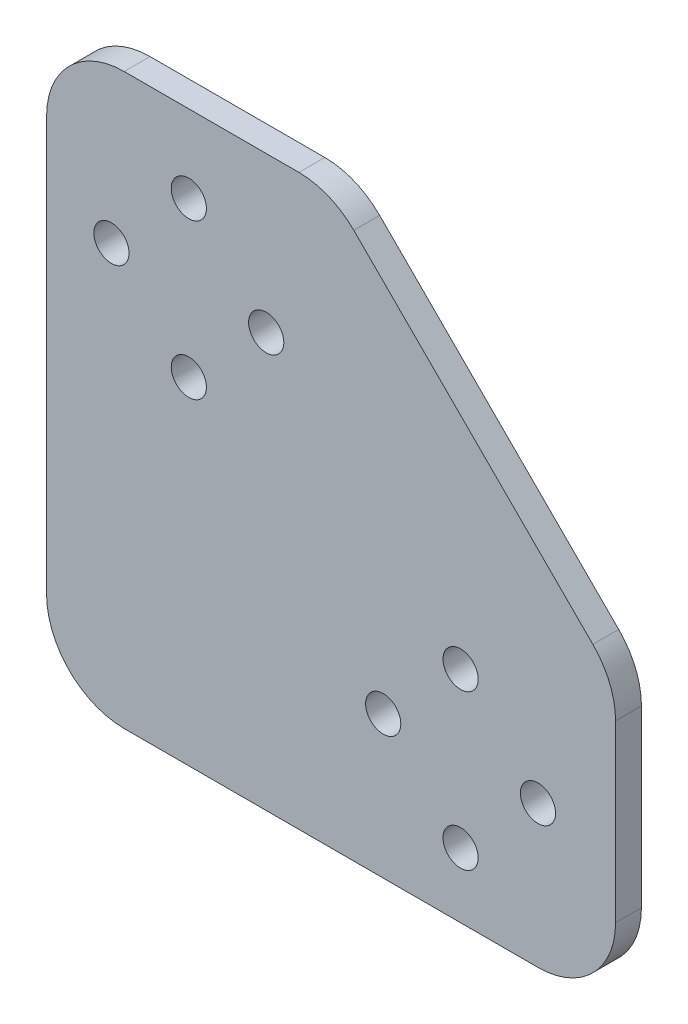
ISO-10303-21;
HEADER;
FILE_DESCRIPTION(('STEP AP214'),'2;1');
FILE_NAME('part.step','',(''),(''),'','','');
FILE_SCHEMA(('AUTOMOTIVE_DESIGN { 1 0 10303 214 1 1 1 1 }'));
ENDSEC;
DATA;
#1=APPLICATION_CONTEXT('core data for automotive mechanical design processes');
#2=APPLICATION_PROTOCOL_DEFINITION('international standard','automotive_design',2000,#1);
#3=PRODUCT_CONTEXT('',#1,'mechanical');
#4=PRODUCT('Part','Part','',(#3));
#5=PRODUCT_RELATED_PRODUCT_CATEGORY('part','',(#4));
#6=PRODUCT_DEFINITION_FORMATION('','',#4);
#7=PRODUCT_DEFINITION_CONTEXT('part definition',#1,'design');
#8=PRODUCT_DEFINITION('design','',#6,#7);
#9=PRODUCT_DEFINITION_SHAPE('','',#8);
#10=(LENGTH_UNIT() NAMED_UNIT(*) SI_UNIT(.MILLI.,.METRE.));
#11=(NAMED_UNIT(*) PLANE_ANGLE_UNIT() SI_UNIT($,.RADIAN.));
#12=(NAMED_UNIT(*) SI_UNIT($,.STERADIAN.) SOLID_ANGLE_UNIT());
#13=UNCERTAINTY_MEASURE_WITH_UNIT(LENGTH_MEASURE(1.E-05),#10,'distance_accuracy_value','');
#14=(GEOMETRIC_REPRESENTATION_CONTEXT(3) GLOBAL_UNCERTAINTY_ASSIGNED_CONTEXT((#13)) GLOBAL_UNIT_ASSIGNED_CONTEXT((#10,
#11,#12)) REPRESENTATION_CONTEXT('',''));
#15=CARTESIAN_POINT('',(0.,0.,0.));
#16=DIRECTION('',(0.,0.,1.));
#17=DIRECTION('',(1.,0.,0.));
#18=AXIS2_PLACEMENT_3D('',#15,#16,#17);
#19=CARTESIAN_POINT('',(0.,0.,1.5875));
#20=DIRECTION('',(0.,0.,-1.));
#21=DIRECTION('',(-1.,0.,0.));
#22=AXIS2_PLACEMENT_3D('',#19,#20,#21);
#23=PLANE('',#22);
#24=DIRECTION('',(-0.707106781186549,0.707106781186546,0.));
#25=VECTOR('',#24,1.);
#26=CARTESIAN_POINT('',(69.85,34.925,1.5875));
#27=LINE('',#26,#25);
#28=CARTESIAN_POINT('',(67.0601920908018,37.7148079091981,1.5875));
#29=VERTEX_POINT('',#28);
#30=CARTESIAN_POINT('',(37.7148079091979,67.060192090802,1.5875));
#31=VERTEX_POINT('',#30);
#32=EDGE_CURVE('E196',#29,#31,#27,.T.);
#33=ORIENTED_EDGE('',*,*,#32,.T.);
#34=CARTESIAN_POINT('',(30.979615818396,60.3250000000001,1.5875));
#35=DIRECTION('',(0.,0.,-1.));
#36=DIRECTION('',(-1.,0.,0.));
#37=AXIS2_PLACEMENT_3D('',#34,#35,#36);
#38=CIRCLE('',#37,9.525);
#39=CARTESIAN_POINT('',(30.979615818396,69.8500000000001,1.5875));
#40=VERTEX_POINT('',#39);
#41=EDGE_CURVE('E167',#31,#40,#38,.F.);
#42=ORIENTED_EDGE('',*,*,#41,.T.);
#43=DIRECTION('',(-1.,0.,0.));
#44=VECTOR('',#43,1.);
#45=CARTESIAN_POINT('',(-2.77555756156289E-13,69.85,1.5875));
#46=LINE('',#45,#44);
#47=CARTESIAN_POINT('',(9.52499999999973,69.85,1.5875));
#48=VERTEX_POINT('',#47);
#49=EDGE_CURVE('E133',#40,#48,#46,.T.);
#50=ORIENTED_EDGE('',*,*,#49,.T.);
#51=CARTESIAN_POINT('',(9.52499999999976,60.325,1.5875));
#52=DIRECTION('',(0.,0.,-1.));
#53=DIRECTION('',(-1.,0.,0.));
#54=AXIS2_PLACEMENT_3D('',#51,#52,#53);
#55=CIRCLE('',#54,9.525);
#56=CARTESIAN_POINT('',(-2.39707243953159E-13,60.325,1.5875));
#57=VERTEX_POINT('',#56);
#58=EDGE_CURVE('E163',#48,#57,#55,.F.);
#59=ORIENTED_EDGE('',*,*,#58,.T.);
#60=DIRECTION('',(0.,-1.,0.));
#61=VECTOR('',#60,1.);
#62=CARTESIAN_POINT('',(0.,0.,1.5875));
#63=LINE('',#62,#61);
#64=CARTESIAN_POINT('',(0.,9.52499999999996,1.5875));
#65=VERTEX_POINT('',#64);
#66=EDGE_CURVE('E141',#57,#65,#63,.T.);
#67=ORIENTED_EDGE('',*,*,#66,.T.);
#68=CARTESIAN_POINT('',(9.52499999999996,9.525,1.5875));
#69=DIRECTION('',(0.,0.,-1.));
#70=DIRECTION('',(-1.,0.,0.));
#71=AXIS2_PLACEMENT_3D('',#68,#69,#70);
#72=CIRCLE('',#71,9.525);
#73=CARTESIAN_POINT('',(9.52499999999996,0.,1.5875));
#74=VERTEX_POINT('',#73);
#75=EDGE_CURVE('E160',#65,#74,#72,.F.);
#76=ORIENTED_EDGE('',*,*,#75,.T.);
#77=DIRECTION('',(1.,0.,0.));
#78=VECTOR('',#77,1.);
#79=CARTESIAN_POINT('',(0.,0.,1.5875));
#80=LINE('',#79,#78);
#81=CARTESIAN_POINT('',(60.325,0.,1.5875));
#82=VERTEX_POINT('',#81);
#83=EDGE_CURVE('E145',#74,#82,#80,.T.);
#84=ORIENTED_EDGE('',*,*,#83,.T.);
#85=CARTESIAN_POINT('',(60.325,9.52499999999999,1.5875));
#86=DIRECTION('',(0.,0.,-1.));
#87=DIRECTION('',(-1.,0.,0.));
#88=AXIS2_PLACEMENT_3D('',#85,#86,#87);
#89=CIRCLE('',#88,9.525);
#90=CARTESIAN_POINT('',(69.85,9.52499999999999,1.5875));
#91=VERTEX_POINT('',#90);
#92=EDGE_CURVE('E57',#82,#91,#89,.F.);
#93=ORIENTED_EDGE('',*,*,#92,.T.);
#94=DIRECTION('',(0.,1.,0.));
#95=VECTOR('',#94,1.);
#96=CARTESIAN_POINT('',(69.85,0.,1.5875));
#97=LINE('',#96,#95);
#98=CARTESIAN_POINT('',(69.85,30.9796158183963,1.5875));
#99=VERTEX_POINT('',#98);
#100=EDGE_CURVE('E199',#91,#99,#97,.T.);
#101=ORIENTED_EDGE('',*,*,#100,.T.);
#102=CARTESIAN_POINT('',(60.325,30.9796158183962,1.5875));
#103=DIRECTION('',(0.,0.,-1.));
#104=DIRECTION('',(-1.,0.,0.));
#105=AXIS2_PLACEMENT_3D('',#102,#103,#104);
#106=CIRCLE('',#105,9.525);
#107=EDGE_CURVE('E165',#99,#29,#106,.F.);
#108=ORIENTED_EDGE('',*,*,#107,.T.);
#109=EDGE_LOOP('',(#33,#42,#50,#59,#67,#76,#84,#93,#101,#108));
#110=FACE_BOUND('',#109,.T.);
#111=CARTESIAN_POINT('',(50.8249999999999,7.96249999999998,1.5875));
#112=DIRECTION('',(0.,0.,1.));
#113=DIRECTION('',(1.,0.,0.));
#114=AXIS2_PLACEMENT_3D('',#111,#112,#113);
#115=CIRCLE('',#114,2.159);
#116=CARTESIAN_POINT('',(52.9839999999999,7.96249999999998,1.5875));
#117=VERTEX_POINT('',#116);
#118=EDGE_CURVE('E192',#117,#117,#115,.T.);
#119=ORIENTED_EDGE('',*,*,#118,.F.);
#120=EDGE_LOOP('',(#119));
#121=FACE_BOUND('',#120,.T.);
#122=CARTESIAN_POINT('',(50.8249999999999,26.9625,1.5875));
#123=DIRECTION('',(0.,0.,1.));
#124=DIRECTION('',(1.,0.,0.));
#125=AXIS2_PLACEMENT_3D('',#122,#123,#124);
#126=CIRCLE('',#125,2.159);
#127=CARTESIAN_POINT('',(52.9839999999999,26.9625,1.5875));
#128=VERTEX_POINT('',#127);
#129=EDGE_CURVE('E205',#128,#128,#126,.T.);
#130=ORIENTED_EDGE('',*,*,#129,.F.);
#131=EDGE_LOOP('',(#130));
#132=FACE_BOUND('',#131,.T.);
#133=CARTESIAN_POINT('',(26.9624999999998,50.825,1.5875));
#134=DIRECTION('',(0.,0.,1.));
#135=DIRECTION('',(-1.,0.,0.));
#136=AXIS2_PLACEMENT_3D('',#133,#134,#135);
#137=CIRCLE('',#136,2.159);
#138=CARTESIAN_POINT('',(24.8034999999998,50.825,1.5875));
#139=VERTEX_POINT('',#138);
#140=EDGE_CURVE('E211',#139,#139,#137,.T.);
#141=ORIENTED_EDGE('',*,*,#140,.F.);
#142=EDGE_LOOP('',(#141));
#143=FACE_BOUND('',#142,.T.);
#144=CARTESIAN_POINT('',(41.3249999999999,17.4625,1.5875));
#145=DIRECTION('',(0.,0.,1.));
#146=DIRECTION('',(1.,0.,0.));
#147=AXIS2_PLACEMENT_3D('',#144,#145,#146);
#148=CIRCLE('',#147,2.159);
#149=CARTESIAN_POINT('',(43.4839999999999,17.4625,1.5875));
#150=VERTEX_POINT('',#149);
#151=EDGE_CURVE('E217',#150,#150,#148,.T.);
#152=ORIENTED_EDGE('',*,*,#151,.F.);
#153=EDGE_LOOP('',(#152));
#154=FACE_BOUND('',#153,.T.);
#155=CARTESIAN_POINT('',(7.96249999999978,50.825,1.5875));
#156=DIRECTION('',(0.,0.,1.));
#157=DIRECTION('',(-1.,0.,0.));
#158=AXIS2_PLACEMENT_3D('',#155,#156,#157);
#159=CIRCLE('',#158,2.159);
#160=CARTESIAN_POINT('',(5.80349999999978,50.825,1.5875));
#161=VERTEX_POINT('',#160);
#162=EDGE_CURVE('E223',#161,#161,#159,.T.);
#163=ORIENTED_EDGE('',*,*,#162,.F.);
#164=EDGE_LOOP('',(#163));
#165=FACE_BOUND('',#164,.T.);
#166=CARTESIAN_POINT('',(60.3249999999999,17.4625,1.5875));
#167=DIRECTION('',(0.,0.,1.));
#168=DIRECTION('',(1.,0.,0.));
#169=AXIS2_PLACEMENT_3D('',#166,#167,#168);
#170=CIRCLE('',#169,2.159);
#171=CARTESIAN_POINT('',(62.4839999999999,17.4625,1.5875));
#172=VERTEX_POINT('',#171);
#173=EDGE_CURVE('E229',#172,#172,#170,.T.);
#174=ORIENTED_EDGE('',*,*,#173,.F.);
#175=EDGE_LOOP('',(#174));
#176=FACE_BOUND('',#175,.T.);
#177=CARTESIAN_POINT('',(17.4624999999998,41.325,1.5875));
#178=DIRECTION('',(0.,0.,1.));
#179=DIRECTION('',(-1.,0.,0.));
#180=AXIS2_PLACEMENT_3D('',#177,#178,#179);
#181=CIRCLE('',#180,2.159);
#182=CARTESIAN_POINT('',(15.3034999999998,41.325,1.5875));
#183=VERTEX_POINT('',#182);
#184=EDGE_CURVE('E235',#183,#183,#181,.T.);
#185=ORIENTED_EDGE('',*,*,#184,.F.);
#186=EDGE_LOOP('',(#185));
#187=FACE_BOUND('',#186,.T.);
#188=CARTESIAN_POINT('',(17.4624999999997,60.325,1.5875));
#189=DIRECTION('',(0.,0.,1.));
#190=DIRECTION('',(-1.,0.,0.));
#191=AXIS2_PLACEMENT_3D('',#188,#189,#190);
#192=CIRCLE('',#191,2.159);
#193=CARTESIAN_POINT('',(15.3034999999997,60.325,1.5875));
#194=VERTEX_POINT('',#193);
#195=EDGE_CURVE('E241',#194,#194,#192,.T.);
#196=ORIENTED_EDGE('',*,*,#195,.F.);
#197=EDGE_LOOP('',(#196));
#198=FACE_BOUND('',#197,.T.);
#199=ADVANCED_FACE('F35',(#110,#121,#132,#143,#154,#165,#176,#187,#198),#23,.F.);
#200=CARTESIAN_POINT('',(0.,0.,-1.5875));
#201=DIRECTION('',(0.,0.,-1.));
#202=DIRECTION('',(-1.,0.,0.));
#203=AXIS2_PLACEMENT_3D('',#200,#201,#202);
#204=PLANE('',#203);
#205=CARTESIAN_POINT('',(17.4624999999998,41.325,-1.5875));
#206=DIRECTION('',(0.,0.,1.));
#207=DIRECTION('',(-1.,0.,0.));
#208=AXIS2_PLACEMENT_3D('',#205,#206,#207);
#209=CIRCLE('',#208,2.159);
#210=CARTESIAN_POINT('',(15.3034999999998,41.325,-1.5875));
#211=VERTEX_POINT('',#210);
#212=EDGE_CURVE('E238',#211,#211,#209,.T.);
#213=ORIENTED_EDGE('',*,*,#212,.T.);
#214=EDGE_LOOP('',(#213));
#215=FACE_BOUND('',#214,.T.);
#216=CARTESIAN_POINT('',(7.96249999999978,50.825,-1.5875));
#217=DIRECTION('',(0.,0.,1.));
#218=DIRECTION('',(-1.,0.,0.));
#219=AXIS2_PLACEMENT_3D('',#216,#217,#218);
#220=CIRCLE('',#219,2.159);
#221=CARTESIAN_POINT('',(5.80349999999978,50.825,-1.5875));
#222=VERTEX_POINT('',#221);
#223=EDGE_CURVE('E226',#222,#222,#220,.T.);
#224=ORIENTED_EDGE('',*,*,#223,.T.);
#225=EDGE_LOOP('',(#224));
#226=FACE_BOUND('',#225,.T.);
#227=CARTESIAN_POINT('',(26.9624999999998,50.825,-1.5875));
#228=DIRECTION('',(0.,0.,1.));
#229=DIRECTION('',(-1.,0.,0.));
#230=AXIS2_PLACEMENT_3D('',#227,#228,#229);
#231=CIRCLE('',#230,2.159);
#232=CARTESIAN_POINT('',(24.8034999999998,50.825,-1.5875));
#233=VERTEX_POINT('',#232);
#234=EDGE_CURVE('E214',#233,#233,#231,.T.);
#235=ORIENTED_EDGE('',*,*,#234,.T.);
#236=EDGE_LOOP('',(#235));
#237=FACE_BOUND('',#236,.T.);
#238=CARTESIAN_POINT('',(50.8249999999999,7.96249999999998,-1.5875));
#239=DIRECTION('',(0.,0.,1.));
#240=DIRECTION('',(1.,0.,0.));
#241=AXIS2_PLACEMENT_3D('',#238,#239,#240);
#242=CIRCLE('',#241,2.159);
#243=CARTESIAN_POINT('',(52.9839999999999,7.96249999999998,-1.5875));
#244=VERTEX_POINT('',#243);
#245=EDGE_CURVE('E202',#244,#244,#242,.T.);
#246=ORIENTED_EDGE('',*,*,#245,.T.);
#247=EDGE_LOOP('',(#246));
#248=FACE_BOUND('',#247,.T.);
#249=DIRECTION('',(-1.,0.,0.));
#250=VECTOR('',#249,1.);
#251=CARTESIAN_POINT('',(-2.77555756156289E-13,69.85,-1.5875));
#252=LINE('',#251,#250);
#253=CARTESIAN_POINT('',(30.979615818396,69.8500000000001,-1.5875));
#254=VERTEX_POINT('',#253);
#255=CARTESIAN_POINT('',(9.52499999999973,69.85,-1.5875));
#256=VERTEX_POINT('',#255);
#257=EDGE_CURVE('E130',#254,#256,#252,.T.);
#258=ORIENTED_EDGE('',*,*,#257,.F.);
#259=CARTESIAN_POINT('',(30.979615818396,60.3250000000001,-1.5875));
#260=DIRECTION('',(0.,0.,-1.));
#261=DIRECTION('',(-1.,0.,0.));
#262=AXIS2_PLACEMENT_3D('',#259,#260,#261);
#263=CIRCLE('',#262,9.525);
#264=CARTESIAN_POINT('',(37.7148079091979,67.060192090802,-1.5875));
#265=VERTEX_POINT('',#264);
#266=EDGE_CURVE('E113',#254,#265,#263,.T.);
#267=ORIENTED_EDGE('',*,*,#266,.T.);
#268=DIRECTION('',(-0.707106781186549,0.707106781186546,0.));
#269=VECTOR('',#268,1.);
#270=CARTESIAN_POINT('',(69.85,34.925,-1.5875));
#271=LINE('',#270,#269);
#272=CARTESIAN_POINT('',(67.0601920908018,37.7148079091981,-1.5875));
#273=VERTEX_POINT('',#272);
#274=EDGE_CURVE('E142',#273,#265,#271,.T.);
#275=ORIENTED_EDGE('',*,*,#274,.F.);
#276=CARTESIAN_POINT('',(60.325,30.9796158183962,-1.5875));
#277=DIRECTION('',(0.,0.,-1.));
#278=DIRECTION('',(-1.,0.,0.));
#279=AXIS2_PLACEMENT_3D('',#276,#277,#278);
#280=CIRCLE('',#279,9.525);
#281=CARTESIAN_POINT('',(69.85,30.9796158183963,-1.5875));
#282=VERTEX_POINT('',#281);
#283=EDGE_CURVE('E124',#273,#282,#280,.T.);
#284=ORIENTED_EDGE('',*,*,#283,.T.);
#285=DIRECTION('',(0.,1.,0.));
#286=VECTOR('',#285,1.);
#287=CARTESIAN_POINT('',(69.85,0.,-1.5875));
#288=LINE('',#287,#286);
#289=CARTESIAN_POINT('',(69.85,9.52499999999999,-1.5875));
#290=VERTEX_POINT('',#289);
#291=EDGE_CURVE('E147',#290,#282,#288,.T.);
#292=ORIENTED_EDGE('',*,*,#291,.F.);
#293=CARTESIAN_POINT('',(60.325,9.52499999999999,-1.5875));
#294=DIRECTION('',(0.,0.,-1.));
#295=DIRECTION('',(-1.,0.,0.));
#296=AXIS2_PLACEMENT_3D('',#293,#294,#295);
#297=CIRCLE('',#296,9.525);
#298=CARTESIAN_POINT('',(60.325,0.,-1.5875));
#299=VERTEX_POINT('',#298);
#300=EDGE_CURVE('E153',#290,#299,#297,.T.);
#301=ORIENTED_EDGE('',*,*,#300,.T.);
#302=DIRECTION('',(1.,0.,0.));
#303=VECTOR('',#302,1.);
#304=CARTESIAN_POINT('',(0.,0.,-1.5875));
#305=LINE('',#304,#303);
#306=CARTESIAN_POINT('',(9.52499999999996,0.,-1.5875));
#307=VERTEX_POINT('',#306);
#308=EDGE_CURVE('E184',#307,#299,#305,.T.);
#309=ORIENTED_EDGE('',*,*,#308,.F.);
#310=CARTESIAN_POINT('',(9.52499999999996,9.525,-1.5875));
#311=DIRECTION('',(0.,0.,-1.));
#312=DIRECTION('',(-1.,0.,0.));
#313=AXIS2_PLACEMENT_3D('',#310,#311,#312);
#314=CIRCLE('',#313,9.525);
#315=CARTESIAN_POINT('',(0.,9.52499999999996,-1.5875));
#316=VERTEX_POINT('',#315);
#317=EDGE_CURVE('E134',#307,#316,#314,.T.);
#318=ORIENTED_EDGE('',*,*,#317,.T.);
#319=DIRECTION('',(0.,-1.,0.));
#320=VECTOR('',#319,1.);
#321=CARTESIAN_POINT('',(0.,0.,-1.5875));
#322=LINE('',#321,#320);
#323=CARTESIAN_POINT('',(-2.39707243953159E-13,60.325,-1.5875));
#324=VERTEX_POINT('',#323);
#325=EDGE_CURVE('E190',#324,#316,#322,.T.);
#326=ORIENTED_EDGE('',*,*,#325,.F.);
#327=CARTESIAN_POINT('',(9.52499999999976,60.325,-1.5875));
#328=DIRECTION('',(0.,0.,-1.));
#329=DIRECTION('',(-1.,0.,0.));
#330=AXIS2_PLACEMENT_3D('',#327,#328,#329);
#331=CIRCLE('',#330,9.525);
#332=EDGE_CURVE('E140',#324,#256,#331,.T.);
#333=ORIENTED_EDGE('',*,*,#332,.T.);
#334=EDGE_LOOP('',(#258,#267,#275,#284,#292,#301,#309,#318,#326,#333));
#335=FACE_BOUND('',#334,.T.);
#336=CARTESIAN_POINT('',(50.8249999999999,26.9625,-1.5875));
#337=DIRECTION('',(0.,0.,1.));
#338=DIRECTION('',(1.,0.,0.));
#339=AXIS2_PLACEMENT_3D('',#336,#337,#338);
#340=CIRCLE('',#339,2.159);
#341=CARTESIAN_POINT('',(52.9839999999999,26.9625,-1.5875));
#342=VERTEX_POINT('',#341);
#343=EDGE_CURVE('E208',#342,#342,#340,.T.);
#344=ORIENTED_EDGE('',*,*,#343,.T.);
#345=EDGE_LOOP('',(#344));
#346=FACE_BOUND('',#345,.T.);
#347=CARTESIAN_POINT('',(41.3249999999999,17.4625,-1.5875));
#348=DIRECTION('',(0.,0.,1.));
#349=DIRECTION('',(1.,0.,0.));
#350=AXIS2_PLACEMENT_3D('',#347,#348,#349);
#351=CIRCLE('',#350,2.159);
#352=CARTESIAN_POINT('',(43.4839999999999,17.4625,-1.5875));
#353=VERTEX_POINT('',#352);
#354=EDGE_CURVE('E220',#353,#353,#351,.T.);
#355=ORIENTED_EDGE('',*,*,#354,.T.);
#356=EDGE_LOOP('',(#355));
#357=FACE_BOUND('',#356,.T.);
#358=CARTESIAN_POINT('',(60.3249999999999,17.4625,-1.5875));
#359=DIRECTION('',(0.,0.,1.));
#360=DIRECTION('',(1.,0.,0.));
#361=AXIS2_PLACEMENT_3D('',#358,#359,#360);
#362=CIRCLE('',#361,2.159);
#363=CARTESIAN_POINT('',(62.4839999999999,17.4625,-1.5875));
#364=VERTEX_POINT('',#363);
#365=EDGE_CURVE('E232',#364,#364,#362,.T.);
#366=ORIENTED_EDGE('',*,*,#365,.T.);
#367=EDGE_LOOP('',(#366));
#368=FACE_BOUND('',#367,.T.);
#369=CARTESIAN_POINT('',(17.4624999999997,60.325,-1.5875));
#370=DIRECTION('',(0.,0.,1.));
#371=DIRECTION('',(-1.,0.,0.));
#372=AXIS2_PLACEMENT_3D('',#369,#370,#371);
#373=CIRCLE('',#372,2.159);
#374=CARTESIAN_POINT('',(15.3034999999997,60.325,-1.5875));
#375=VERTEX_POINT('',#374);
#376=EDGE_CURVE('E244',#375,#375,#373,.T.);
#377=ORIENTED_EDGE('',*,*,#376,.T.);
#378=EDGE_LOOP('',(#377));
#379=FACE_BOUND('',#378,.T.);
#380=ADVANCED_FACE('F137',(#215,#226,#237,#248,#335,#346,#357,#368,#379),#204,.T.);
#381=CARTESIAN_POINT('',(0.,0.,1.5875));
#382=DIRECTION('',(1.,0.,0.));
#383=DIRECTION('',(0.,1.,0.));
#384=AXIS2_PLACEMENT_3D('',#381,#382,#383);
#385=PLANE('',#384);
#386=ORIENTED_EDGE('',*,*,#66,.F.);
#387=DIRECTION('',(0.,0.,-1.));
#388=VECTOR('',#387,1.);
#389=CARTESIAN_POINT('',(-2.39707243953159E-13,60.325,1.5875));
#390=LINE('',#389,#388);
#391=EDGE_CURVE('E175',#57,#324,#390,.T.);
#392=ORIENTED_EDGE('',*,*,#391,.T.);
#393=ORIENTED_EDGE('',*,*,#325,.T.);
#394=DIRECTION('',(0.,0.,-1.));
#395=VECTOR('',#394,1.);
#396=CARTESIAN_POINT('',(0.,9.52499999999996,1.5875));
#397=LINE('',#396,#395);
#398=EDGE_CURVE('E173',#316,#65,#397,.F.);
#399=ORIENTED_EDGE('',*,*,#398,.T.);
#400=EDGE_LOOP('',(#386,#392,#393,#399));
#401=FACE_BOUND('',#400,.T.);
#402=ADVANCED_FACE('F258',(#401),#385,.F.);
#403=CARTESIAN_POINT('',(0.,0.,1.5875));
#404=DIRECTION('',(0.,1.,0.));
#405=DIRECTION('',(-1.,0.,0.));
#406=AXIS2_PLACEMENT_3D('',#403,#404,#405);
#407=PLANE('',#406);
#408=ORIENTED_EDGE('',*,*,#308,.T.);
#409=DIRECTION('',(0.,0.,-1.));
#410=VECTOR('',#409,1.);
#411=CARTESIAN_POINT('',(60.325,0.,1.5875));
#412=LINE('',#411,#410);
#413=EDGE_CURVE('E11',#299,#82,#412,.F.);
#414=ORIENTED_EDGE('',*,*,#413,.T.);
#415=ORIENTED_EDGE('',*,*,#83,.F.);
#416=DIRECTION('',(0.,0.,-1.));
#417=VECTOR('',#416,1.);
#418=CARTESIAN_POINT('',(9.52499999999996,0.,1.5875));
#419=LINE('',#418,#417);
#420=EDGE_CURVE('E43',#74,#307,#419,.T.);
#421=ORIENTED_EDGE('',*,*,#420,.T.);
#422=EDGE_LOOP('',(#408,#414,#415,#421));
#423=FACE_BOUND('',#422,.T.);
#424=ADVANCED_FACE('F183',(#423),#407,.F.);
#425=CARTESIAN_POINT('',(69.85,0.,1.5875));
#426=DIRECTION('',(-1.,0.,0.));
#427=DIRECTION('',(0.,-1.,0.));
#428=AXIS2_PLACEMENT_3D('',#425,#426,#427);
#429=PLANE('',#428);
#430=ORIENTED_EDGE('',*,*,#291,.T.);
#431=DIRECTION('',(0.,0.,-1.));
#432=VECTOR('',#431,1.);
#433=CARTESIAN_POINT('',(69.85,30.9796158183963,1.5875));
#434=LINE('',#433,#432);
#435=EDGE_CURVE('E50',#282,#99,#434,.F.);
#436=ORIENTED_EDGE('',*,*,#435,.T.);
#437=ORIENTED_EDGE('',*,*,#100,.F.);
#438=DIRECTION('',(0.,0.,-1.));
#439=VECTOR('',#438,1.);
#440=CARTESIAN_POINT('',(69.85,9.52499999999999,1.5875));
#441=LINE('',#440,#439);
#442=EDGE_CURVE('E169',#91,#290,#441,.T.);
#443=ORIENTED_EDGE('',*,*,#442,.T.);
#444=EDGE_LOOP('',(#430,#436,#437,#443));
#445=FACE_BOUND('',#444,.T.);
#446=ADVANCED_FACE('F271',(#445),#429,.F.);
#447=CARTESIAN_POINT('',(69.85,34.925,1.5875));
#448=DIRECTION('',(-0.707106781186546,-0.707106781186549,0.));
#449=DIRECTION('',(0.707106781186549,-0.707106781186546,0.));
#450=AXIS2_PLACEMENT_3D('',#447,#448,#449);
#451=PLANE('',#450);
#452=ORIENTED_EDGE('',*,*,#274,.T.);
#453=DIRECTION('',(0.,0.,-1.));
#454=VECTOR('',#453,1.);
#455=CARTESIAN_POINT('',(37.7148079091979,67.060192090802,1.5875));
#456=LINE('',#455,#454);
#457=EDGE_CURVE('E118',#265,#31,#456,.F.);
#458=ORIENTED_EDGE('',*,*,#457,.T.);
#459=ORIENTED_EDGE('',*,*,#32,.F.);
#460=DIRECTION('',(0.,0.,-1.));
#461=VECTOR('',#460,1.);
#462=CARTESIAN_POINT('',(67.0601920908018,37.7148079091981,1.5875));
#463=LINE('',#462,#461);
#464=EDGE_CURVE('E123',#29,#273,#463,.T.);
#465=ORIENTED_EDGE('',*,*,#464,.T.);
#466=EDGE_LOOP('',(#452,#458,#459,#465));
#467=FACE_BOUND('',#466,.T.);
#468=ADVANCED_FACE('F268',(#467),#451,.F.);
#469=CARTESIAN_POINT('',(-2.77555756156289E-13,69.85,1.5875));
#470=DIRECTION('',(0.,-1.,0.));
#471=DIRECTION('',(1.,0.,0.));
#472=AXIS2_PLACEMENT_3D('',#469,#470,#471);
#473=PLANE('',#472);
#474=ORIENTED_EDGE('',*,*,#49,.F.);
#475=DIRECTION('',(0.,0.,-1.));
#476=VECTOR('',#475,1.);
#477=CARTESIAN_POINT('',(30.979615818396,69.8500000000001,1.5875));
#478=LINE('',#477,#476);
#479=EDGE_CURVE('E117',#40,#254,#478,.T.);
#480=ORIENTED_EDGE('',*,*,#479,.T.);
#481=ORIENTED_EDGE('',*,*,#257,.T.);
#482=DIRECTION('',(0.,0.,-1.));
#483=VECTOR('',#482,1.);
#484=CARTESIAN_POINT('',(9.52499999999973,69.85,1.5875));
#485=LINE('',#484,#483);
#486=EDGE_CURVE('E135',#256,#48,#485,.F.);
#487=ORIENTED_EDGE('',*,*,#486,.T.);
#488=EDGE_LOOP('',(#474,#480,#481,#487));
#489=FACE_BOUND('',#488,.T.);
#490=ADVANCED_FACE('F129',(#489),#473,.F.);
#491=CARTESIAN_POINT('',(50.8249999999999,7.96249999999998,1.5875));
#492=DIRECTION('',(0.,0.,-1.));
#493=DIRECTION('',(-1.,0.,0.));
#494=AXIS2_PLACEMENT_3D('',#491,#492,#493);
#495=CYLINDRICAL_SURFACE('',#494,2.159);
#496=ORIENTED_EDGE('',*,*,#118,.T.);
#497=EDGE_LOOP('',(#496));
#498=FACE_BOUND('',#497,.T.);
#499=ORIENTED_EDGE('',*,*,#245,.F.);
#500=EDGE_LOOP('',(#499));
#501=FACE_BOUND('',#500,.T.);
#502=ADVANCED_FACE('F263',(#498,#501),#495,.F.);
#503=CARTESIAN_POINT('',(50.8249999999999,26.9625,1.5875));
#504=DIRECTION('',(0.,0.,-1.));
#505=DIRECTION('',(-1.,0.,0.));
#506=AXIS2_PLACEMENT_3D('',#503,#504,#505);
#507=CYLINDRICAL_SURFACE('',#506,2.159);
#508=ORIENTED_EDGE('',*,*,#129,.T.);
#509=EDGE_LOOP('',(#508));
#510=FACE_BOUND('',#509,.T.);
#511=ORIENTED_EDGE('',*,*,#343,.F.);
#512=EDGE_LOOP('',(#511));
#513=FACE_BOUND('',#512,.T.);
#514=ADVANCED_FACE('F427',(#510,#513),#507,.F.);
#515=CARTESIAN_POINT('',(26.9624999999998,50.825,1.5875));
#516=DIRECTION('',(0.,0.,-1.));
#517=DIRECTION('',(-1.,0.,0.));
#518=AXIS2_PLACEMENT_3D('',#515,#516,#517);
#519=CYLINDRICAL_SURFACE('',#518,2.159);
#520=ORIENTED_EDGE('',*,*,#140,.T.);
#521=EDGE_LOOP('',(#520));
#522=FACE_BOUND('',#521,.T.);
#523=ORIENTED_EDGE('',*,*,#234,.F.);
#524=EDGE_LOOP('',(#523));
#525=FACE_BOUND('',#524,.T.);
#526=ADVANCED_FACE('F417',(#522,#525),#519,.F.);
#527=CARTESIAN_POINT('',(41.3249999999999,17.4625,1.5875));
#528=DIRECTION('',(0.,0.,-1.));
#529=DIRECTION('',(-1.,0.,0.));
#530=AXIS2_PLACEMENT_3D('',#527,#528,#529);
#531=CYLINDRICAL_SURFACE('',#530,2.159);
#532=ORIENTED_EDGE('',*,*,#151,.T.);
#533=EDGE_LOOP('',(#532));
#534=FACE_BOUND('',#533,.T.);
#535=ORIENTED_EDGE('',*,*,#354,.F.);
#536=EDGE_LOOP('',(#535));
#537=FACE_BOUND('',#536,.T.);
#538=ADVANCED_FACE('F407',(#534,#537),#531,.F.);
#539=CARTESIAN_POINT('',(7.96249999999978,50.825,1.5875));
#540=DIRECTION('',(0.,0.,-1.));
#541=DIRECTION('',(-1.,0.,0.));
#542=AXIS2_PLACEMENT_3D('',#539,#540,#541);
#543=CYLINDRICAL_SURFACE('',#542,2.159);
#544=ORIENTED_EDGE('',*,*,#162,.T.);
#545=EDGE_LOOP('',(#544));
#546=FACE_BOUND('',#545,.T.);
#547=ORIENTED_EDGE('',*,*,#223,.F.);
#548=EDGE_LOOP('',(#547));
#549=FACE_BOUND('',#548,.T.);
#550=ADVANCED_FACE('F397',(#546,#549),#543,.F.);
#551=CARTESIAN_POINT('',(60.3249999999999,17.4625,1.5875));
#552=DIRECTION('',(0.,0.,-1.));
#553=DIRECTION('',(-1.,0.,0.));
#554=AXIS2_PLACEMENT_3D('',#551,#552,#553);
#555=CYLINDRICAL_SURFACE('',#554,2.159);
#556=ORIENTED_EDGE('',*,*,#173,.T.);
#557=EDGE_LOOP('',(#556));
#558=FACE_BOUND('',#557,.T.);
#559=ORIENTED_EDGE('',*,*,#365,.F.);
#560=EDGE_LOOP('',(#559));
#561=FACE_BOUND('',#560,.T.);
#562=ADVANCED_FACE('F387',(#558,#561),#555,.F.);
#563=CARTESIAN_POINT('',(17.4624999999998,41.325,1.5875));
#564=DIRECTION('',(0.,0.,-1.));
#565=DIRECTION('',(-1.,0.,0.));
#566=AXIS2_PLACEMENT_3D('',#563,#564,#565);
#567=CYLINDRICAL_SURFACE('',#566,2.159);
#568=ORIENTED_EDGE('',*,*,#184,.T.);
#569=EDGE_LOOP('',(#568));
#570=FACE_BOUND('',#569,.T.);
#571=ORIENTED_EDGE('',*,*,#212,.F.);
#572=EDGE_LOOP('',(#571));
#573=FACE_BOUND('',#572,.T.);
#574=ADVANCED_FACE('F378',(#570,#573),#567,.F.);
#575=CARTESIAN_POINT('',(17.4624999999997,60.325,1.5875));
#576=DIRECTION('',(0.,0.,-1.));
#577=DIRECTION('',(-1.,0.,0.));
#578=AXIS2_PLACEMENT_3D('',#575,#576,#577);
#579=CYLINDRICAL_SURFACE('',#578,2.159);
#580=ORIENTED_EDGE('',*,*,#195,.T.);
#581=EDGE_LOOP('',(#580));
#582=FACE_BOUND('',#581,.T.);
#583=ORIENTED_EDGE('',*,*,#376,.F.);
#584=EDGE_LOOP('',(#583));
#585=FACE_BOUND('',#584,.T.);
#586=ADVANCED_FACE('F250',(#582,#585),#579,.F.);
#587=CARTESIAN_POINT('',(30.979615818396,60.3250000000001,1.5875));
#588=DIRECTION('',(0.,0.,-1.));
#589=DIRECTION('',(-1.,0.,0.));
#590=AXIS2_PLACEMENT_3D('',#587,#588,#589);
#591=CYLINDRICAL_SURFACE('',#590,9.525);
#592=ORIENTED_EDGE('',*,*,#41,.F.);
#593=ORIENTED_EDGE('',*,*,#457,.F.);
#594=ORIENTED_EDGE('',*,*,#266,.F.);
#595=ORIENTED_EDGE('',*,*,#479,.F.);
#596=EDGE_LOOP('',(#592,#593,#594,#595));
#597=FACE_BOUND('',#596,.T.);
#598=ADVANCED_FACE('F116',(#597),#591,.T.);
#599=CARTESIAN_POINT('',(60.325,30.9796158183962,1.5875));
#600=DIRECTION('',(0.,0.,-1.));
#601=DIRECTION('',(-1.,0.,0.));
#602=AXIS2_PLACEMENT_3D('',#599,#600,#601);
#603=CYLINDRICAL_SURFACE('',#602,9.525);
#604=ORIENTED_EDGE('',*,*,#107,.F.);
#605=ORIENTED_EDGE('',*,*,#435,.F.);
#606=ORIENTED_EDGE('',*,*,#283,.F.);
#607=ORIENTED_EDGE('',*,*,#464,.F.);
#608=EDGE_LOOP('',(#604,#605,#606,#607));
#609=FACE_BOUND('',#608,.T.);
#610=ADVANCED_FACE('F282',(#609),#603,.T.);
#611=CARTESIAN_POINT('',(9.52499999999976,60.325,1.5875));
#612=DIRECTION('',(0.,0.,-1.));
#613=DIRECTION('',(-1.,0.,0.));
#614=AXIS2_PLACEMENT_3D('',#611,#612,#613);
#615=CYLINDRICAL_SURFACE('',#614,9.525);
#616=ORIENTED_EDGE('',*,*,#58,.F.);
#617=ORIENTED_EDGE('',*,*,#486,.F.);
#618=ORIENTED_EDGE('',*,*,#332,.F.);
#619=ORIENTED_EDGE('',*,*,#391,.F.);
#620=EDGE_LOOP('',(#616,#617,#618,#619));
#621=FACE_BOUND('',#620,.T.);
#622=ADVANCED_FACE('F285',(#621),#615,.T.);
#623=CARTESIAN_POINT('',(60.325,9.52499999999999,1.5875));
#624=DIRECTION('',(0.,0.,-1.));
#625=DIRECTION('',(-1.,0.,0.));
#626=AXIS2_PLACEMENT_3D('',#623,#624,#625);
#627=CYLINDRICAL_SURFACE('',#626,9.525);
#628=ORIENTED_EDGE('',*,*,#92,.F.);
#629=ORIENTED_EDGE('',*,*,#413,.F.);
#630=ORIENTED_EDGE('',*,*,#300,.F.);
#631=ORIENTED_EDGE('',*,*,#442,.F.);
#632=EDGE_LOOP('',(#628,#629,#630,#631));
#633=FACE_BOUND('',#632,.T.);
#634=ADVANCED_FACE('F288',(#633),#627,.T.);
#635=CARTESIAN_POINT('',(9.52499999999996,9.525,1.5875));
#636=DIRECTION('',(0.,0.,-1.));
#637=DIRECTION('',(-1.,0.,0.));
#638=AXIS2_PLACEMENT_3D('',#635,#636,#637);
#639=CYLINDRICAL_SURFACE('',#638,9.525);
#640=ORIENTED_EDGE('',*,*,#75,.F.);
#641=ORIENTED_EDGE('',*,*,#398,.F.);
#642=ORIENTED_EDGE('',*,*,#317,.F.);
#643=ORIENTED_EDGE('',*,*,#420,.F.);
#644=EDGE_LOOP('',(#640,#641,#642,#643));
#645=FACE_BOUND('',#644,.T.);
#646=ADVANCED_FACE('F37',(#645),#639,.T.);
#647=CLOSED_SHELL('',(#199,#380,#402,#424,#446,#468,#490,#502,#514,#526,#538,#550,#562,#574,
#586,#598,#610,#622,#634,#646));
#648=MANIFOLD_SOLID_BREP('B2',#647);
#649=ADVANCED_BREP_SHAPE_REPRESENTATION('',(#18,#648),#14);
#650=SHAPE_DEFINITION_REPRESENTATION(#9,#649);
ENDSEC;
END-ISO-10303-21;
